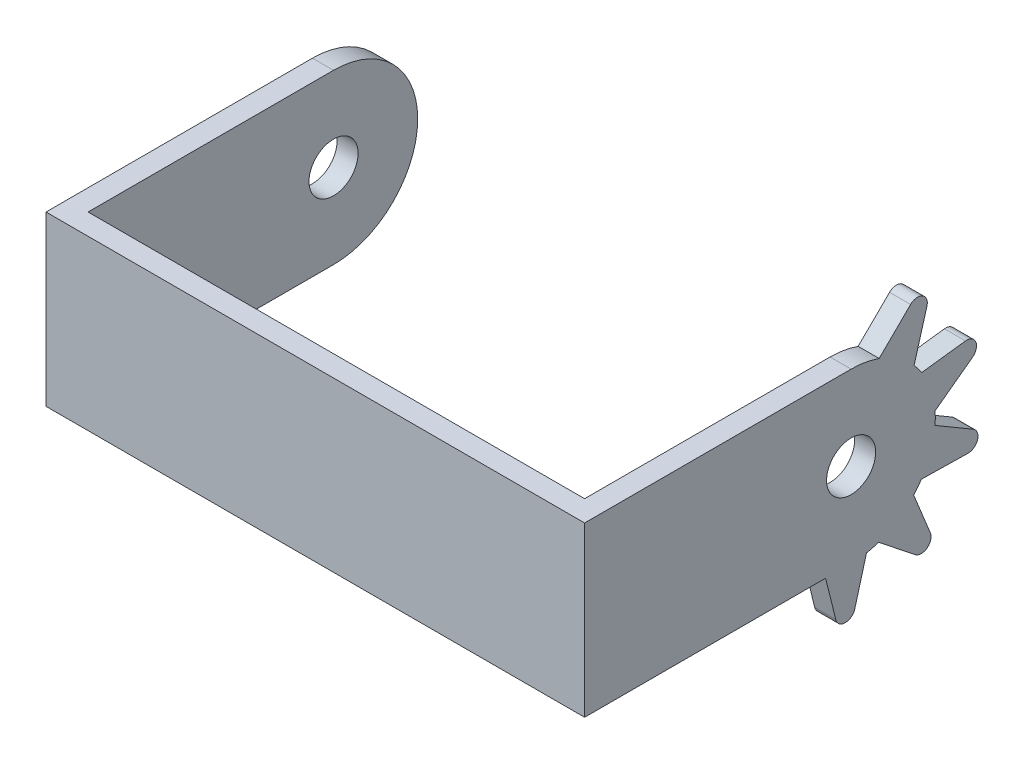
ISO-10303-21;
HEADER;
FILE_DESCRIPTION(('STEP AP214'),'2;1');
FILE_NAME('part.step','',(''),(''),'','','');
FILE_SCHEMA(('AUTOMOTIVE_DESIGN { 1 0 10303 214 1 1 1 1 }'));
ENDSEC;
DATA;
#1=APPLICATION_CONTEXT('core data for automotive mechanical design processes');
#2=APPLICATION_PROTOCOL_DEFINITION('international standard','automotive_design',2000,#1);
#3=PRODUCT_CONTEXT('',#1,'mechanical');
#4=PRODUCT('Part','Part','',(#3));
#5=PRODUCT_RELATED_PRODUCT_CATEGORY('part','',(#4));
#6=PRODUCT_DEFINITION_FORMATION('','',#4);
#7=PRODUCT_DEFINITION_CONTEXT('part definition',#1,'design');
#8=PRODUCT_DEFINITION('design','',#6,#7);
#9=PRODUCT_DEFINITION_SHAPE('','',#8);
#10=(LENGTH_UNIT() NAMED_UNIT(*) SI_UNIT(.MILLI.,.METRE.));
#11=(NAMED_UNIT(*) PLANE_ANGLE_UNIT() SI_UNIT($,.RADIAN.));
#12=(NAMED_UNIT(*) SI_UNIT($,.STERADIAN.) SOLID_ANGLE_UNIT());
#13=UNCERTAINTY_MEASURE_WITH_UNIT(LENGTH_MEASURE(1.E-05),#10,'distance_accuracy_value','');
#14=(GEOMETRIC_REPRESENTATION_CONTEXT(3) GLOBAL_UNCERTAINTY_ASSIGNED_CONTEXT((#13)) GLOBAL_UNIT_ASSIGNED_CONTEXT((#10,
#11,#12)) REPRESENTATION_CONTEXT('',''));
#15=CARTESIAN_POINT('',(0.,0.,0.));
#16=DIRECTION('',(0.,0.,1.));
#17=DIRECTION('',(1.,0.,0.));
#18=AXIS2_PLACEMENT_3D('',#15,#16,#17);
#19=CARTESIAN_POINT('',(38.4,6.,-19.));
#20=DIRECTION('',(-1.,0.,0.));
#21=DIRECTION('',(0.,0.,1.));
#22=AXIS2_PLACEMENT_3D('',#19,#20,#21);
#23=CYLINDRICAL_SURFACE('',#22,6.);
#24=DIRECTION('',(1.,0.,0.));
#25=VECTOR('',#24,1.);
#26=CARTESIAN_POINT('',(31.5101792591606,1.98768601255906,-23.4610913985465));
#27=LINE('',#26,#25);
#28=CARTESIAN_POINT('',(36.9,1.98768601255906,-23.4610913985465));
#29=VERTEX_POINT('',#28);
#30=CARTESIAN_POINT('',(38.4,1.98768601255906,-23.4610913985465));
#31=VERTEX_POINT('',#30);
#32=EDGE_CURVE('E269',#29,#31,#27,.T.);
#33=ORIENTED_EDGE('',*,*,#32,.F.);
#34=CARTESIAN_POINT('',(36.9,6.,-19.));
#35=DIRECTION('',(1.,0.,0.));
#36=DIRECTION('',(0.,0.,-1.));
#37=AXIS2_PLACEMENT_3D('',#34,#35,#36);
#38=CIRCLE('',#37,6.);
#39=CARTESIAN_POINT('',(36.9,2.69507903422514,-24.0077437444404));
#40=VERTEX_POINT('',#39);
#41=EDGE_CURVE('E435',#40,#29,#38,.F.);
#42=ORIENTED_EDGE('',*,*,#41,.F.);
#43=DIRECTION('',(1.,0.,0.));
#44=VECTOR('',#43,1.);
#45=CARTESIAN_POINT('',(31.5101792591606,2.69507903422514,-24.0077437444404));
#46=LINE('',#45,#44);
#47=CARTESIAN_POINT('',(38.4,2.69507903422514,-24.0077437444404));
#48=VERTEX_POINT('',#47);
#49=EDGE_CURVE('E58',#40,#48,#46,.T.);
#50=ORIENTED_EDGE('',*,*,#49,.T.);
#51=CARTESIAN_POINT('',(38.4,6.,-19.));
#52=DIRECTION('',(-1.,0.,0.));
#53=DIRECTION('',(0.,0.,1.));
#54=AXIS2_PLACEMENT_3D('',#51,#52,#53);
#55=CIRCLE('',#54,6.);
#56=EDGE_CURVE('E442',#31,#48,#55,.F.);
#57=ORIENTED_EDGE('',*,*,#56,.F.);
#58=EDGE_LOOP('',(#33,#42,#50,#57));
#59=FACE_BOUND('',#58,.T.);
#60=ADVANCED_FACE('F35',(#59),#23,.T.);
#61=DIRECTION('',(1.,0.,0.));
#62=VECTOR('',#61,1.);
#63=CARTESIAN_POINT('',(31.5101792591606,5.5325576704835,-24.9817637590076));
#64=LINE('',#63,#62);
#65=CARTESIAN_POINT('',(36.9,5.5325576704835,-24.9817637590076));
#66=VERTEX_POINT('',#65);
#67=CARTESIAN_POINT('',(38.4,5.5325576704835,-24.9817637590076));
#68=VERTEX_POINT('',#67);
#69=EDGE_CURVE('E291',#66,#68,#64,.T.);
#70=ORIENTED_EDGE('',*,*,#69,.F.);
#71=CARTESIAN_POINT('',(36.9,6.,-25.));
#72=VERTEX_POINT('',#71);
#73=EDGE_CURVE('E431',#72,#66,#38,.F.);
#74=ORIENTED_EDGE('',*,*,#73,.F.);
#75=DIRECTION('',(-1.,0.,0.));
#76=VECTOR('',#75,1.);
#77=CARTESIAN_POINT('',(38.4,6.,-25.));
#78=LINE('',#77,#76);
#79=CARTESIAN_POINT('',(38.4,6.,-25.));
#80=VERTEX_POINT('',#79);
#81=EDGE_CURVE('E371',#72,#80,#78,.F.);
#82=ORIENTED_EDGE('',*,*,#81,.T.);
#83=EDGE_CURVE('E439',#68,#80,#55,.F.);
#84=ORIENTED_EDGE('',*,*,#83,.F.);
#85=EDGE_LOOP('',(#70,#74,#82,#84));
#86=FACE_BOUND('',#85,.T.);
#87=ADVANCED_FACE('F450',(#86),#23,.T.);
#88=CARTESIAN_POINT('',(0.,6.,-19.0000000000001));
#89=DIRECTION('',(1.,0.,0.));
#90=DIRECTION('',(0.,0.,-1.));
#91=AXIS2_PLACEMENT_3D('',#88,#89,#90);
#92=CYLINDRICAL_SURFACE('',#91,6.);
#93=DIRECTION('',(1.,0.,0.));
#94=VECTOR('',#93,1.);
#95=CARTESIAN_POINT('',(31.5101792591606,9.27062012041001,-24.0302131195377));
#96=LINE('',#95,#94);
#97=CARTESIAN_POINT('',(36.9,9.27062012041001,-24.0302131195377));
#98=VERTEX_POINT('',#97);
#99=CARTESIAN_POINT('',(38.4,9.27062012041001,-24.0302131195377));
#100=VERTEX_POINT('',#99);
#101=EDGE_CURVE('E313',#98,#100,#96,.T.);
#102=ORIENTED_EDGE('',*,*,#101,.F.);
#103=CARTESIAN_POINT('',(36.9,6.,-19.));
#104=DIRECTION('',(1.,0.,0.));
#105=DIRECTION('',(0.,0.,-1.));
#106=AXIS2_PLACEMENT_3D('',#103,#104,#105);
#107=CIRCLE('',#106,6.);
#108=CARTESIAN_POINT('',(36.9,9.98173252569031,-23.4884079687413));
#109=VERTEX_POINT('',#108);
#110=EDGE_CURVE('E430',#109,#98,#107,.F.);
#111=ORIENTED_EDGE('',*,*,#110,.F.);
#112=DIRECTION('',(1.,0.,0.));
#113=VECTOR('',#112,1.);
#114=CARTESIAN_POINT('',(31.5101792591606,9.98173252569031,-23.4884079687412));
#115=LINE('',#114,#113);
#116=CARTESIAN_POINT('',(38.4,9.98173252569031,-23.4884079687412));
#117=VERTEX_POINT('',#116);
#118=EDGE_CURVE('E349',#109,#117,#115,.T.);
#119=ORIENTED_EDGE('',*,*,#118,.T.);
#120=CARTESIAN_POINT('',(38.4,6.,-19.));
#121=DIRECTION('',(-1.,0.,0.));
#122=DIRECTION('',(0.,0.,1.));
#123=AXIS2_PLACEMENT_3D('',#120,#121,#122);
#124=CIRCLE('',#123,6.);
#125=EDGE_CURVE('E440',#100,#117,#124,.F.);
#126=ORIENTED_EDGE('',*,*,#125,.F.);
#127=EDGE_LOOP('',(#102,#111,#119,#126));
#128=FACE_BOUND('',#127,.T.);
#129=ADVANCED_FACE('F499',(#128),#92,.T.);
#130=DIRECTION('',(1.,0.,0.));
#131=VECTOR('',#130,1.);
#132=CARTESIAN_POINT('',(31.5101792591606,11.656957124219,-20.9997090025172));
#133=LINE('',#132,#131);
#134=CARTESIAN_POINT('',(36.9,11.656957124219,-20.9997090025172));
#135=VERTEX_POINT('',#134);
#136=CARTESIAN_POINT('',(38.4,11.656957124219,-20.9997090025172));
#137=VERTEX_POINT('',#136);
#138=EDGE_CURVE('E338',#135,#137,#133,.T.);
#139=ORIENTED_EDGE('',*,*,#138,.F.);
#140=CARTESIAN_POINT('',(36.9,12.,-19.));
#141=VERTEX_POINT('',#140);
#142=EDGE_CURVE('E426',#141,#135,#107,.F.);
#143=ORIENTED_EDGE('',*,*,#142,.F.);
#144=DIRECTION('',(-1.,0.,0.));
#145=VECTOR('',#144,1.);
#146=CARTESIAN_POINT('',(36.9,12.,-19.));
#147=LINE('',#146,#145);
#148=CARTESIAN_POINT('',(38.4,12.,-19.));
#149=VERTEX_POINT('',#148);
#150=EDGE_CURVE('E421',#149,#141,#147,.T.);
#151=ORIENTED_EDGE('',*,*,#150,.F.);
#152=EDGE_CURVE('E434',#137,#149,#124,.F.);
#153=ORIENTED_EDGE('',*,*,#152,.F.);
#154=EDGE_LOOP('',(#139,#143,#151,#153));
#155=FACE_BOUND('',#154,.T.);
#156=ADVANCED_FACE('F512',(#155),#92,.T.);
#157=CARTESIAN_POINT('',(0.,12.,-25.));
#158=DIRECTION('',(1.,0.,0.));
#159=DIRECTION('',(0.,0.,-1.));
#160=AXIS2_PLACEMENT_3D('',#157,#158,#159);
#161=PLANE('',#160);
#162=CARTESIAN_POINT('',(0.,6.,-19.));
#163=DIRECTION('',(-1.,0.,0.));
#164=DIRECTION('',(0.,0.,1.));
#165=AXIS2_PLACEMENT_3D('',#162,#163,#164);
#166=CIRCLE('',#165,1.75);
#167=CARTESIAN_POINT('',(0.,6.,-17.25));
#168=VERTEX_POINT('',#167);
#169=EDGE_CURVE('E368',#168,#168,#166,.T.);
#170=ORIENTED_EDGE('',*,*,#169,.F.);
#171=EDGE_LOOP('',(#170));
#172=FACE_BOUND('',#171,.T.);
#173=CARTESIAN_POINT('',(0.,6.,-19.));
#174=DIRECTION('',(1.,0.,0.));
#175=DIRECTION('',(0.,0.,-1.));
#176=AXIS2_PLACEMENT_3D('',#173,#174,#175);
#177=CIRCLE('',#176,6.);
#178=CARTESIAN_POINT('',(0.,12.,-19.));
#179=VERTEX_POINT('',#178);
#180=CARTESIAN_POINT('',(0.,6.,-25.));
#181=VERTEX_POINT('',#180);
#182=EDGE_CURVE('E410',#179,#181,#177,.F.);
#183=ORIENTED_EDGE('',*,*,#182,.T.);
#184=CARTESIAN_POINT('',(0.,6.,-19.));
#185=DIRECTION('',(1.,0.,0.));
#186=DIRECTION('',(0.,0.,-1.));
#187=AXIS2_PLACEMENT_3D('',#184,#185,#186);
#188=CIRCLE('',#187,6.);
#189=CARTESIAN_POINT('',(0.,0.,-19.));
#190=VERTEX_POINT('',#189);
#191=EDGE_CURVE('E412',#181,#190,#188,.F.);
#192=ORIENTED_EDGE('',*,*,#191,.T.);
#193=DIRECTION('',(0.,0.,1.));
#194=VECTOR('',#193,1.);
#195=CARTESIAN_POINT('',(0.,0.,-25.));
#196=LINE('',#195,#194);
#197=CARTESIAN_POINT('',(0.,0.,0.));
#198=VERTEX_POINT('',#197);
#199=EDGE_CURVE('E388',#190,#198,#196,.T.);
#200=ORIENTED_EDGE('',*,*,#199,.T.);
#201=DIRECTION('',(0.,-1.,0.));
#202=VECTOR('',#201,1.);
#203=CARTESIAN_POINT('',(0.,12.,0.));
#204=LINE('',#203,#202);
#205=CARTESIAN_POINT('',(0.,12.,0.));
#206=VERTEX_POINT('',#205);
#207=EDGE_CURVE('E407',#206,#198,#204,.T.);
#208=ORIENTED_EDGE('',*,*,#207,.F.);
#209=DIRECTION('',(0.,0.,1.));
#210=VECTOR('',#209,1.);
#211=CARTESIAN_POINT('',(0.,12.,-25.));
#212=LINE('',#211,#210);
#213=EDGE_CURVE('E372',#179,#206,#212,.T.);
#214=ORIENTED_EDGE('',*,*,#213,.F.);
#215=EDGE_LOOP('',(#183,#192,#200,#208,#214));
#216=FACE_BOUND('',#215,.T.);
#217=ADVANCED_FACE('F523',(#172,#216),#161,.F.);
#218=CARTESIAN_POINT('',(0.,12.,0.));
#219=DIRECTION('',(0.,0.,-1.));
#220=DIRECTION('',(-1.,0.,0.));
#221=AXIS2_PLACEMENT_3D('',#218,#219,#220);
#222=PLANE('',#221);
#223=DIRECTION('',(1.,0.,0.));
#224=VECTOR('',#223,1.);
#225=CARTESIAN_POINT('',(0.,0.,0.));
#226=LINE('',#225,#224);
#227=CARTESIAN_POINT('',(38.4,0.,0.));
#228=VERTEX_POINT('',#227);
#229=EDGE_CURVE('E390',#198,#228,#226,.T.);
#230=ORIENTED_EDGE('',*,*,#229,.T.);
#231=DIRECTION('',(0.,-1.,0.));
#232=VECTOR('',#231,1.);
#233=CARTESIAN_POINT('',(38.4,12.,0.));
#234=LINE('',#233,#232);
#235=CARTESIAN_POINT('',(38.4,12.,0.));
#236=VERTEX_POINT('',#235);
#237=EDGE_CURVE('E405',#236,#228,#234,.T.);
#238=ORIENTED_EDGE('',*,*,#237,.F.);
#239=DIRECTION('',(1.,0.,0.));
#240=VECTOR('',#239,1.);
#241=CARTESIAN_POINT('',(0.,12.,0.));
#242=LINE('',#241,#240);
#243=EDGE_CURVE('E374',#206,#236,#242,.T.);
#244=ORIENTED_EDGE('',*,*,#243,.F.);
#245=ORIENTED_EDGE('',*,*,#207,.T.);
#246=EDGE_LOOP('',(#230,#238,#244,#245));
#247=FACE_BOUND('',#246,.T.);
#248=ADVANCED_FACE('F529',(#247),#222,.F.);
#249=CARTESIAN_POINT('',(38.4,12.,0.));
#250=DIRECTION('',(-1.,0.,0.));
#251=DIRECTION('',(0.,0.,1.));
#252=AXIS2_PLACEMENT_3D('',#249,#250,#251);
#253=PLANE('',#252);
#254=CARTESIAN_POINT('',(38.4,6.,-19.));
#255=DIRECTION('',(1.,0.,0.));
#256=DIRECTION('',(0.,0.,-1.));
#257=AXIS2_PLACEMENT_3D('',#254,#255,#256);
#258=CIRCLE('',#257,1.75);
#259=CARTESIAN_POINT('',(38.4,6.,-20.75));
#260=VERTEX_POINT('',#259);
#261=EDGE_CURVE('E359',#260,#260,#258,.T.);
#262=ORIENTED_EDGE('',*,*,#261,.F.);
#263=EDGE_LOOP('',(#262));
#264=FACE_BOUND('',#263,.T.);
#265=DIRECTION('',(0.,0.,-1.));
#266=VECTOR('',#265,1.);
#267=CARTESIAN_POINT('',(38.4,0.,0.));
#268=LINE('',#267,#266);
#269=CARTESIAN_POINT('',(38.4,0.,-17.1803883802412));
#270=VERTEX_POINT('',#269);
#271=EDGE_CURVE('E239',#228,#270,#268,.T.);
#272=ORIENTED_EDGE('',*,*,#271,.T.);
#273=DIRECTION('',(0.,-0.970350908801074,-0.24170046294728));
#274=VECTOR('',#273,1.);
#275=CARTESIAN_POINT('',(38.4,-2.92064558122937,-17.9078792113265));
#276=LINE('',#275,#274);
#277=CARTESIAN_POINT('',(38.4,-2.92064558122937,-17.9078792113265));
#278=VERTEX_POINT('',#277);
#279=EDGE_CURVE('E230',#270,#278,#276,.T.);
#280=ORIENTED_EDGE('',*,*,#279,.T.);
#281=CARTESIAN_POINT('',(38.4,-2.75145525716627,-18.5871248474872));
#282=DIRECTION('',(1.,0.,0.));
#283=DIRECTION('',(0.,0.,-1.));
#284=AXIS2_PLACEMENT_3D('',#281,#282,#283);
#285=CIRCLE('',#284,0.700000000000001);
#286=CARTESIAN_POINT('',(38.4,-2.93688346534044,-19.2621184619854));
#287=VERTEX_POINT('',#286);
#288=EDGE_CURVE('E235',#278,#287,#285,.T.);
#289=ORIENTED_EDGE('',*,*,#288,.T.);
#290=DIRECTION('',(0.,0.964276592140255,-0.264897440248817));
#291=VECTOR('',#290,1.);
#292=CARTESIAN_POINT('',(38.4,0.101076921048923,-20.0966797657558));
#293=LINE('',#292,#291);
#294=CARTESIAN_POINT('',(38.4,0.101076921048923,-20.0966797657558));
#295=VERTEX_POINT('',#294);
#296=EDGE_CURVE('E251',#287,#295,#293,.T.);
#297=ORIENTED_EDGE('',*,*,#296,.T.);
#298=CARTESIAN_POINT('',(38.4,0.329508674429189,-20.961001817089));
#299=VERTEX_POINT('',#298);
#300=EDGE_CURVE('E43',#295,#299,#55,.F.);
#301=ORIENTED_EDGE('',*,*,#300,.T.);
#302=DIRECTION('',(0.,-0.6226932155362,-0.782466075510746));
#303=VECTOR('',#302,1.);
#304=CARTESIAN_POINT('',(38.4,-1.74206498138611,-23.564107276013));
#305=LINE('',#304,#303);
#306=CARTESIAN_POINT('',(38.4,-1.74206498138611,-23.564107276013));
#307=VERTEX_POINT('',#306);
#308=EDGE_CURVE('E264',#299,#307,#305,.T.);
#309=ORIENTED_EDGE('',*,*,#308,.T.);
#310=CARTESIAN_POINT('',(38.4,-1.19433872852859,-23.9999925268884));
#311=DIRECTION('',(1.,0.,0.));
#312=DIRECTION('',(0.,0.,-1.));
#313=AXIS2_PLACEMENT_3D('',#310,#311,#312);
#314=CIRCLE('',#313,0.700000000000001);
#315=CARTESIAN_POINT('',(38.4,-0.930538739534189,-24.6483825066124));
#316=VERTEX_POINT('',#315);
#317=EDGE_CURVE('E274',#307,#316,#314,.T.);
#318=ORIENTED_EDGE('',*,*,#317,.T.);
#319=DIRECTION('',(0.,0.926271399605786,0.376857127134858));
#320=VECTOR('',#319,1.);
#321=CARTESIAN_POINT('',(38.4,1.98768601255906,-23.4610913985465));
#322=LINE('',#321,#320);
#323=EDGE_CURVE('E277',#316,#31,#322,.T.);
#324=ORIENTED_EDGE('',*,*,#323,.T.);
#325=ORIENTED_EDGE('',*,*,#56,.T.);
#326=DIRECTION('',(0.,-0.01768057624368,-0.999843686394874));
#327=VECTOR('',#326,1.);
#328=CARTESIAN_POINT('',(38.4,2.63625935375937,-27.3340202944191));
#329=LINE('',#328,#327);
#330=CARTESIAN_POINT('',(38.4,2.63625935375937,-27.3340202944191));
#331=VERTEX_POINT('',#330);
#332=EDGE_CURVE('E287',#48,#331,#329,.T.);
#333=ORIENTED_EDGE('',*,*,#332,.T.);
#334=CARTESIAN_POINT('',(38.4,3.33614993423578,-27.3463966977896));
#335=DIRECTION('',(1.,0.,0.));
#336=DIRECTION('',(0.,0.,-1.));
#337=AXIS2_PLACEMENT_3D('',#334,#335,#336);
#338=CIRCLE('',#337,0.699999999999999);
#339=CARTESIAN_POINT('',(38.4,3.94015134728499,-27.7002077957424));
#340=VERTEX_POINT('',#339);
#341=EDGE_CURVE('E296',#331,#340,#338,.T.);
#342=ORIENTED_EDGE('',*,*,#341,.T.);
#343=DIRECTION('',(0.,0.505444425646849,0.862859161498867));
#344=VECTOR('',#343,1.);
#345=CARTESIAN_POINT('',(38.4,5.5325576704835,-24.9817637590076));
#346=LINE('',#345,#344);
#347=EDGE_CURVE('E299',#340,#68,#346,.T.);
#348=ORIENTED_EDGE('',*,*,#347,.T.);
#349=ORIENTED_EDGE('',*,*,#83,.T.);
#350=CARTESIAN_POINT('',(38.4,6.42655115037831,-24.9848186368603));
#351=VERTEX_POINT('',#350);
#352=EDGE_CURVE('E436',#80,#351,#124,.F.);
#353=ORIENTED_EDGE('',*,*,#352,.T.);
#354=DIRECTION('',(0.,0.594639327093802,-0.803992581230343));
#355=VECTOR('',#354,1.);
#356=CARTESIAN_POINT('',(38.4,8.40479522624884,-27.6595384012527));
#357=LINE('',#356,#355);
#358=CARTESIAN_POINT('',(38.4,8.40479522624884,-27.6595384012527));
#359=VERTEX_POINT('',#358);
#360=EDGE_CURVE('E309',#351,#359,#357,.T.);
#361=ORIENTED_EDGE('',*,*,#360,.T.);
#362=CARTESIAN_POINT('',(38.4,8.96759003311008,-27.2432908722871));
#363=DIRECTION('',(1.,0.,0.));
#364=DIRECTION('',(0.,0.,-1.));
#365=AXIS2_PLACEMENT_3D('',#362,#363,#364);
#366=CIRCLE('',#365,0.700000000000001);
#367=CARTESIAN_POINT('',(38.4,9.66216312128219,-27.156295325349));
#368=VERTEX_POINT('',#367);
#369=EDGE_CURVE('E318',#359,#368,#366,.T.);
#370=ORIENTED_EDGE('',*,*,#369,.T.);
#371=DIRECTION('',(0.,-0.124279352768693,0.992247268817302));
#372=VECTOR('',#371,1.);
#373=CARTESIAN_POINT('',(38.4,9.27062012041001,-24.0302131195377));
#374=LINE('',#373,#372);
#375=EDGE_CURVE('E321',#368,#100,#374,.T.);
#376=ORIENTED_EDGE('',*,*,#375,.T.);
#377=ORIENTED_EDGE('',*,*,#125,.T.);
#378=DIRECTION('',(0.,0.961198769080563,-0.275856713382167));
#379=VECTOR('',#378,1.);
#380=CARTESIAN_POINT('',(38.4,13.1794452971628,-24.4061271376103));
#381=LINE('',#380,#379);
#382=CARTESIAN_POINT('',(38.4,13.1794452971628,-24.4061271376103));
#383=VERTEX_POINT('',#382);
#384=EDGE_CURVE('E334',#117,#383,#381,.T.);
#385=ORIENTED_EDGE('',*,*,#384,.T.);
#386=CARTESIAN_POINT('',(38.4,13.3725449965303,-23.7332879992539));
#387=DIRECTION('',(1.,0.,0.));
#388=DIRECTION('',(0.,0.,-1.));
#389=AXIS2_PLACEMENT_3D('',#386,#387,#388);
#390=CIRCLE('',#389,0.699999999999999);
#391=CARTESIAN_POINT('',(38.4,13.8706273426367,-23.2414404857935));
#392=VERTEX_POINT('',#391);
#393=EDGE_CURVE('E343',#383,#392,#390,.T.);
#394=ORIENTED_EDGE('',*,*,#393,.T.);
#395=DIRECTION('',(0.,-0.702639304943415,0.711546208723394));
#396=VECTOR('',#395,1.);
#397=CARTESIAN_POINT('',(38.4,11.656957124219,-20.9997090025172));
#398=LINE('',#397,#396);
#399=EDGE_CURVE('E346',#392,#137,#398,.T.);
#400=ORIENTED_EDGE('',*,*,#399,.T.);
#401=ORIENTED_EDGE('',*,*,#152,.T.);
#402=DIRECTION('',(0.,0.,-1.));
#403=VECTOR('',#402,1.);
#404=CARTESIAN_POINT('',(38.4,12.,0.));
#405=LINE('',#404,#403);
#406=EDGE_CURVE('E377',#236,#149,#405,.T.);
#407=ORIENTED_EDGE('',*,*,#406,.F.);
#408=ORIENTED_EDGE('',*,*,#237,.T.);
#409=EDGE_LOOP('',(#272,#280,#289,#297,#301,#309,#318,#324,#325,#333,#342,#348,#349,#353,#361,
#370,#376,#377,#385,#394,#400,#401,#407,#408));
#410=FACE_BOUND('',#409,.T.);
#411=ADVANCED_FACE('F232',(#264,#410),#253,.F.);
#412=CARTESIAN_POINT('',(36.9,12.,-25.));
#413=DIRECTION('',(1.,0.,0.));
#414=DIRECTION('',(0.,0.,-1.));
#415=AXIS2_PLACEMENT_3D('',#412,#413,#414);
#416=PLANE('',#415);
#417=DIRECTION('',(0.,0.970350908801074,0.24170046294728));
#418=VECTOR('',#417,1.);
#419=CARTESIAN_POINT('',(36.9,-2.92064558122937,-17.9078792113265));
#420=LINE('',#419,#418);
#421=CARTESIAN_POINT('',(36.9,-2.92064558122937,-17.9078792113265));
#422=VERTEX_POINT('',#421);
#423=CARTESIAN_POINT('',(36.9,0.,-17.1803883802412));
#424=VERTEX_POINT('',#423);
#425=EDGE_CURVE('E247',#422,#424,#420,.T.);
#426=ORIENTED_EDGE('',*,*,#425,.T.);
#427=DIRECTION('',(0.,0.,1.));
#428=VECTOR('',#427,1.);
#429=CARTESIAN_POINT('',(36.9,0.,-25.));
#430=LINE('',#429,#428);
#431=CARTESIAN_POINT('',(36.9,0.,-1.5));
#432=VERTEX_POINT('',#431);
#433=EDGE_CURVE('E394',#424,#432,#430,.T.);
#434=ORIENTED_EDGE('',*,*,#433,.T.);
#435=DIRECTION('',(0.,-1.,0.));
#436=VECTOR('',#435,1.);
#437=CARTESIAN_POINT('',(36.9,12.,-1.5));
#438=LINE('',#437,#436);
#439=CARTESIAN_POINT('',(36.9,12.,-1.5));
#440=VERTEX_POINT('',#439);
#441=EDGE_CURVE('E402',#440,#432,#438,.T.);
#442=ORIENTED_EDGE('',*,*,#441,.F.);
#443=DIRECTION('',(0.,0.,1.));
#444=VECTOR('',#443,1.);
#445=CARTESIAN_POINT('',(36.9,12.,-25.));
#446=LINE('',#445,#444);
#447=EDGE_CURVE('E380',#141,#440,#446,.T.);
#448=ORIENTED_EDGE('',*,*,#447,.F.);
#449=ORIENTED_EDGE('',*,*,#142,.T.);
#450=DIRECTION('',(0.,0.702639304943415,-0.711546208723394));
#451=VECTOR('',#450,1.);
#452=CARTESIAN_POINT('',(36.9,11.656957124219,-20.9997090025172));
#453=LINE('',#452,#451);
#454=CARTESIAN_POINT('',(36.9,13.8706273426367,-23.2414404857935));
#455=VERTEX_POINT('',#454);
#456=EDGE_CURVE('E337',#135,#455,#453,.T.);
#457=ORIENTED_EDGE('',*,*,#456,.T.);
#458=CARTESIAN_POINT('',(36.9,13.3725449965303,-23.7332879992539));
#459=DIRECTION('',(1.,0.,0.));
#460=DIRECTION('',(0.,0.,-1.));
#461=AXIS2_PLACEMENT_3D('',#458,#459,#460);
#462=CIRCLE('',#461,0.699999999999999);
#463=CARTESIAN_POINT('',(36.9,13.1794452971628,-24.4061271376103));
#464=VERTEX_POINT('',#463);
#465=EDGE_CURVE('E335',#455,#464,#462,.F.);
#466=ORIENTED_EDGE('',*,*,#465,.T.);
#467=DIRECTION('',(0.,-0.961198769080563,0.275856713382167));
#468=VECTOR('',#467,1.);
#469=CARTESIAN_POINT('',(36.9,13.1794452971628,-24.4061271376103));
#470=LINE('',#469,#468);
#471=EDGE_CURVE('E340',#464,#109,#470,.T.);
#472=ORIENTED_EDGE('',*,*,#471,.T.);
#473=ORIENTED_EDGE('',*,*,#110,.T.);
#474=DIRECTION('',(0.,0.124279352768693,-0.992247268817302));
#475=VECTOR('',#474,1.);
#476=CARTESIAN_POINT('',(36.9,9.27062012041001,-24.0302131195377));
#477=LINE('',#476,#475);
#478=CARTESIAN_POINT('',(36.9,9.66216312128219,-27.156295325349));
#479=VERTEX_POINT('',#478);
#480=EDGE_CURVE('E312',#98,#479,#477,.T.);
#481=ORIENTED_EDGE('',*,*,#480,.T.);
#482=CARTESIAN_POINT('',(36.9,8.96759003311008,-27.2432908722871));
#483=DIRECTION('',(1.,0.,0.));
#484=DIRECTION('',(0.,0.,-1.));
#485=AXIS2_PLACEMENT_3D('',#482,#483,#484);
#486=CIRCLE('',#485,0.700000000000001);
#487=CARTESIAN_POINT('',(36.9,8.40479522624884,-27.6595384012527));
#488=VERTEX_POINT('',#487);
#489=EDGE_CURVE('E310',#479,#488,#486,.F.);
#490=ORIENTED_EDGE('',*,*,#489,.T.);
#491=DIRECTION('',(0.,-0.594639327093802,0.803992581230343));
#492=VECTOR('',#491,1.);
#493=CARTESIAN_POINT('',(36.9,8.40479522624884,-27.6595384012527));
#494=LINE('',#493,#492);
#495=CARTESIAN_POINT('',(36.9,6.42655115037831,-24.9848186368604));
#496=VERTEX_POINT('',#495);
#497=EDGE_CURVE('E315',#488,#496,#494,.T.);
#498=ORIENTED_EDGE('',*,*,#497,.T.);
#499=EDGE_CURVE('E425',#496,#72,#107,.F.);
#500=ORIENTED_EDGE('',*,*,#499,.T.);
#501=ORIENTED_EDGE('',*,*,#73,.T.);
#502=DIRECTION('',(0.,-0.505444425646849,-0.862859161498867));
#503=VECTOR('',#502,1.);
#504=CARTESIAN_POINT('',(36.9,5.5325576704835,-24.9817637590076));
#505=LINE('',#504,#503);
#506=CARTESIAN_POINT('',(36.9,3.94015134728499,-27.7002077957424));
#507=VERTEX_POINT('',#506);
#508=EDGE_CURVE('E290',#66,#507,#505,.T.);
#509=ORIENTED_EDGE('',*,*,#508,.T.);
#510=CARTESIAN_POINT('',(36.9,3.33614993423578,-27.3463966977896));
#511=DIRECTION('',(1.,0.,0.));
#512=DIRECTION('',(0.,0.,-1.));
#513=AXIS2_PLACEMENT_3D('',#510,#511,#512);
#514=CIRCLE('',#513,0.699999999999999);
#515=CARTESIAN_POINT('',(36.9,2.63625935375937,-27.3340202944191));
#516=VERTEX_POINT('',#515);
#517=EDGE_CURVE('E288',#507,#516,#514,.F.);
#518=ORIENTED_EDGE('',*,*,#517,.T.);
#519=DIRECTION('',(0.,0.01768057624368,0.999843686394874));
#520=VECTOR('',#519,1.);
#521=CARTESIAN_POINT('',(36.9,2.63625935375937,-27.3340202944191));
#522=LINE('',#521,#520);
#523=EDGE_CURVE('E293',#516,#40,#522,.T.);
#524=ORIENTED_EDGE('',*,*,#523,.T.);
#525=ORIENTED_EDGE('',*,*,#41,.T.);
#526=DIRECTION('',(0.,-0.926271399605786,-0.376857127134858));
#527=VECTOR('',#526,1.);
#528=CARTESIAN_POINT('',(36.9,1.98768601255906,-23.4610913985465));
#529=LINE('',#528,#527);
#530=CARTESIAN_POINT('',(36.9,-0.930538739534189,-24.6483825066124));
#531=VERTEX_POINT('',#530);
#532=EDGE_CURVE('E268',#29,#531,#529,.T.);
#533=ORIENTED_EDGE('',*,*,#532,.T.);
#534=CARTESIAN_POINT('',(36.9,-1.19433872852859,-23.9999925268884));
#535=DIRECTION('',(1.,0.,0.));
#536=DIRECTION('',(0.,0.,-1.));
#537=AXIS2_PLACEMENT_3D('',#534,#535,#536);
#538=CIRCLE('',#537,0.700000000000001);
#539=CARTESIAN_POINT('',(36.9,-1.74206498138611,-23.564107276013));
#540=VERTEX_POINT('',#539);
#541=EDGE_CURVE('E266',#531,#540,#538,.F.);
#542=ORIENTED_EDGE('',*,*,#541,.T.);
#543=DIRECTION('',(0.,0.6226932155362,0.782466075510746));
#544=VECTOR('',#543,1.);
#545=CARTESIAN_POINT('',(36.9,-1.74206498138611,-23.564107276013));
#546=LINE('',#545,#544);
#547=CARTESIAN_POINT('',(36.9,0.329508674429193,-20.961001817089));
#548=VERTEX_POINT('',#547);
#549=EDGE_CURVE('E271',#540,#548,#546,.T.);
#550=ORIENTED_EDGE('',*,*,#549,.T.);
#551=CARTESIAN_POINT('',(36.9,0.101076921048923,-20.0966797657558));
#552=VERTEX_POINT('',#551);
#553=EDGE_CURVE('E429',#548,#552,#38,.F.);
#554=ORIENTED_EDGE('',*,*,#553,.T.);
#555=DIRECTION('',(0.,-0.964276592140255,0.264897440248817));
#556=VECTOR('',#555,1.);
#557=CARTESIAN_POINT('',(36.9,0.101076921048923,-20.0966797657558));
#558=LINE('',#557,#556);
#559=CARTESIAN_POINT('',(36.9,-2.93688346534044,-19.2621184619854));
#560=VERTEX_POINT('',#559);
#561=EDGE_CURVE('E265',#552,#560,#558,.T.);
#562=ORIENTED_EDGE('',*,*,#561,.T.);
#563=CARTESIAN_POINT('',(36.9,-2.75145525716627,-18.5871248474872));
#564=DIRECTION('',(1.,0.,0.));
#565=DIRECTION('',(0.,0.,-1.));
#566=AXIS2_PLACEMENT_3D('',#563,#564,#565);
#567=CIRCLE('',#566,0.700000000000001);
#568=EDGE_CURVE('E261',#560,#422,#567,.F.);
#569=ORIENTED_EDGE('',*,*,#568,.T.);
#570=EDGE_LOOP('',(#426,#434,#442,#448,#449,#457,#466,#472,#473,#481,#490,#498,#500,#501,#509,
#518,#524,#525,#533,#542,#550,#554,#562,#569));
#571=FACE_BOUND('',#570,.T.);
#572=CARTESIAN_POINT('',(36.9,6.,-19.));
#573=DIRECTION('',(1.,0.,0.));
#574=DIRECTION('',(0.,0.,-1.));
#575=AXIS2_PLACEMENT_3D('',#572,#573,#574);
#576=CIRCLE('',#575,1.75);
#577=CARTESIAN_POINT('',(36.9,6.,-20.75));
#578=VERTEX_POINT('',#577);
#579=EDGE_CURVE('E362',#578,#578,#576,.F.);
#580=ORIENTED_EDGE('',*,*,#579,.F.);
#581=EDGE_LOOP('',(#580));
#582=FACE_BOUND('',#581,.T.);
#583=ADVANCED_FACE('F467',(#571,#582),#416,.F.);
#584=CARTESIAN_POINT('',(36.9,12.,-1.5));
#585=DIRECTION('',(0.,0.,1.));
#586=DIRECTION('',(1.,0.,0.));
#587=AXIS2_PLACEMENT_3D('',#584,#585,#586);
#588=PLANE('',#587);
#589=DIRECTION('',(-1.,0.,0.));
#590=VECTOR('',#589,1.);
#591=CARTESIAN_POINT('',(36.9,0.,-1.5));
#592=LINE('',#591,#590);
#593=CARTESIAN_POINT('',(1.5,0.,-1.5));
#594=VERTEX_POINT('',#593);
#595=EDGE_CURVE('E396',#432,#594,#592,.T.);
#596=ORIENTED_EDGE('',*,*,#595,.T.);
#597=DIRECTION('',(0.,-1.,0.));
#598=VECTOR('',#597,1.);
#599=CARTESIAN_POINT('',(1.5,12.,-1.5));
#600=LINE('',#599,#598);
#601=CARTESIAN_POINT('',(1.5,12.,-1.5));
#602=VERTEX_POINT('',#601);
#603=EDGE_CURVE('E387',#602,#594,#600,.T.);
#604=ORIENTED_EDGE('',*,*,#603,.F.);
#605=DIRECTION('',(-1.,0.,0.));
#606=VECTOR('',#605,1.);
#607=CARTESIAN_POINT('',(36.9,12.,-1.5));
#608=LINE('',#607,#606);
#609=EDGE_CURVE('E382',#440,#602,#608,.T.);
#610=ORIENTED_EDGE('',*,*,#609,.F.);
#611=ORIENTED_EDGE('',*,*,#441,.T.);
#612=EDGE_LOOP('',(#596,#604,#610,#611));
#613=FACE_BOUND('',#612,.T.);
#614=ADVANCED_FACE('F601',(#613),#588,.F.);
#615=CARTESIAN_POINT('',(1.5,12.,-1.5));
#616=DIRECTION('',(-1.,0.,0.));
#617=DIRECTION('',(0.,0.,1.));
#618=AXIS2_PLACEMENT_3D('',#615,#616,#617);
#619=PLANE('',#618);
#620=CARTESIAN_POINT('',(1.5,6.,-19.));
#621=DIRECTION('',(-1.,0.,0.));
#622=DIRECTION('',(0.,0.,1.));
#623=AXIS2_PLACEMENT_3D('',#620,#621,#622);
#624=CIRCLE('',#623,1.75);
#625=CARTESIAN_POINT('',(1.5,6.,-17.25));
#626=VERTEX_POINT('',#625);
#627=EDGE_CURVE('E365',#626,#626,#624,.F.);
#628=ORIENTED_EDGE('',*,*,#627,.F.);
#629=EDGE_LOOP('',(#628));
#630=FACE_BOUND('',#629,.T.);
#631=DIRECTION('',(0.,0.,-1.));
#632=VECTOR('',#631,1.);
#633=CARTESIAN_POINT('',(1.5,0.,-1.5));
#634=LINE('',#633,#632);
#635=CARTESIAN_POINT('',(1.5,0.,-19.));
#636=VERTEX_POINT('',#635);
#637=EDGE_CURVE('E375',#594,#636,#634,.T.);
#638=ORIENTED_EDGE('',*,*,#637,.T.);
#639=CARTESIAN_POINT('',(1.5,6.,-19.));
#640=DIRECTION('',(-1.,0.,0.));
#641=DIRECTION('',(0.,0.,1.));
#642=AXIS2_PLACEMENT_3D('',#639,#640,#641);
#643=CIRCLE('',#642,6.);
#644=CARTESIAN_POINT('',(1.5,6.,-25.));
#645=VERTEX_POINT('',#644);
#646=EDGE_CURVE('E419',#636,#645,#643,.F.);
#647=ORIENTED_EDGE('',*,*,#646,.T.);
#648=CARTESIAN_POINT('',(1.5,6.,-19.));
#649=DIRECTION('',(-1.,0.,0.));
#650=DIRECTION('',(0.,0.,1.));
#651=AXIS2_PLACEMENT_3D('',#648,#649,#650);
#652=CIRCLE('',#651,6.);
#653=CARTESIAN_POINT('',(1.5,12.,-19.));
#654=VERTEX_POINT('',#653);
#655=EDGE_CURVE('E417',#645,#654,#652,.F.);
#656=ORIENTED_EDGE('',*,*,#655,.T.);
#657=DIRECTION('',(0.,0.,-1.));
#658=VECTOR('',#657,1.);
#659=CARTESIAN_POINT('',(1.5,12.,-1.5));
#660=LINE('',#659,#658);
#661=EDGE_CURVE('E384',#602,#654,#660,.T.);
#662=ORIENTED_EDGE('',*,*,#661,.F.);
#663=ORIENTED_EDGE('',*,*,#603,.T.);
#664=EDGE_LOOP('',(#638,#647,#656,#662,#663));
#665=FACE_BOUND('',#664,.T.);
#666=ADVANCED_FACE('F596',(#630,#665),#619,.F.);
#667=CARTESIAN_POINT('',(0.,12.,0.));
#668=DIRECTION('',(0.,1.,0.));
#669=DIRECTION('',(0.,0.,1.));
#670=AXIS2_PLACEMENT_3D('',#667,#668,#669);
#671=PLANE('',#670);
#672=ORIENTED_EDGE('',*,*,#661,.T.);
#673=DIRECTION('',(-1.,0.,0.));
#674=VECTOR('',#673,1.);
#675=CARTESIAN_POINT('',(0.,12.,-19.));
#676=LINE('',#675,#674);
#677=EDGE_CURVE('E423',#654,#179,#676,.T.);
#678=ORIENTED_EDGE('',*,*,#677,.T.);
#679=ORIENTED_EDGE('',*,*,#213,.T.);
#680=ORIENTED_EDGE('',*,*,#243,.T.);
#681=ORIENTED_EDGE('',*,*,#406,.T.);
#682=ORIENTED_EDGE('',*,*,#150,.T.);
#683=ORIENTED_EDGE('',*,*,#447,.T.);
#684=ORIENTED_EDGE('',*,*,#609,.T.);
#685=EDGE_LOOP('',(#672,#678,#679,#680,#681,#682,#683,#684));
#686=FACE_BOUND('',#685,.T.);
#687=ADVANCED_FACE('F543',(#686),#671,.T.);
#688=CARTESIAN_POINT('',(0.,0.,0.));
#689=DIRECTION('',(0.,1.,0.));
#690=DIRECTION('',(0.,0.,1.));
#691=AXIS2_PLACEMENT_3D('',#688,#689,#690);
#692=PLANE('',#691);
#693=ORIENTED_EDGE('',*,*,#433,.F.);
#694=DIRECTION('',(1.,0.,0.));
#695=VECTOR('',#694,1.);
#696=CARTESIAN_POINT('',(0.,0.,-17.1803883802412));
#697=LINE('',#696,#695);
#698=EDGE_CURVE('E11',#424,#270,#697,.T.);
#699=ORIENTED_EDGE('',*,*,#698,.T.);
#700=ORIENTED_EDGE('',*,*,#271,.F.);
#701=ORIENTED_EDGE('',*,*,#229,.F.);
#702=ORIENTED_EDGE('',*,*,#199,.F.);
#703=DIRECTION('',(-1.,0.,0.));
#704=VECTOR('',#703,1.);
#705=CARTESIAN_POINT('',(0.,0.,-19.));
#706=LINE('',#705,#704);
#707=EDGE_CURVE('E414',#190,#636,#706,.F.);
#708=ORIENTED_EDGE('',*,*,#707,.T.);
#709=ORIENTED_EDGE('',*,*,#637,.F.);
#710=ORIENTED_EDGE('',*,*,#595,.F.);
#711=EDGE_LOOP('',(#693,#699,#700,#701,#702,#708,#709,#710));
#712=FACE_BOUND('',#711,.T.);
#713=ADVANCED_FACE('F595',(#712),#692,.F.);
#714=CARTESIAN_POINT('',(0.,6.,-19.));
#715=DIRECTION('',(1.,0.,0.));
#716=DIRECTION('',(0.,0.,-1.));
#717=AXIS2_PLACEMENT_3D('',#714,#715,#716);
#718=CYLINDRICAL_SURFACE('',#717,6.);
#719=ORIENTED_EDGE('',*,*,#677,.F.);
#720=ORIENTED_EDGE('',*,*,#655,.F.);
#721=DIRECTION('',(-1.,0.,0.));
#722=VECTOR('',#721,1.);
#723=CARTESIAN_POINT('',(1.5,6.,-25.));
#724=LINE('',#723,#722);
#725=EDGE_CURVE('E391',#181,#645,#724,.F.);
#726=ORIENTED_EDGE('',*,*,#725,.F.);
#727=ORIENTED_EDGE('',*,*,#182,.F.);
#728=EDGE_LOOP('',(#719,#720,#726,#727));
#729=FACE_BOUND('',#728,.T.);
#730=ADVANCED_FACE('F517',(#729),#718,.T.);
#731=CARTESIAN_POINT('',(1.5,6.,-19.));
#732=DIRECTION('',(-1.,0.,0.));
#733=DIRECTION('',(0.,0.,1.));
#734=AXIS2_PLACEMENT_3D('',#731,#732,#733);
#735=CYLINDRICAL_SURFACE('',#734,6.);
#736=ORIENTED_EDGE('',*,*,#646,.F.);
#737=ORIENTED_EDGE('',*,*,#707,.F.);
#738=ORIENTED_EDGE('',*,*,#191,.F.);
#739=ORIENTED_EDGE('',*,*,#725,.T.);
#740=EDGE_LOOP('',(#736,#737,#738,#739));
#741=FACE_BOUND('',#740,.T.);
#742=ADVANCED_FACE('F511',(#741),#735,.T.);
#743=DIRECTION('',(1.,0.,0.));
#744=VECTOR('',#743,1.);
#745=CARTESIAN_POINT('',(31.5101792591606,6.42655115037831,-24.9848186368603));
#746=LINE('',#745,#744);
#747=EDGE_CURVE('E324',#496,#351,#746,.T.);
#748=ORIENTED_EDGE('',*,*,#747,.T.);
#749=ORIENTED_EDGE('',*,*,#352,.F.);
#750=ORIENTED_EDGE('',*,*,#81,.F.);
#751=ORIENTED_EDGE('',*,*,#499,.F.);
#752=EDGE_LOOP('',(#748,#749,#750,#751));
#753=FACE_BOUND('',#752,.T.);
#754=ADVANCED_FACE('F37',(#753),#92,.T.);
#755=DIRECTION('',(1.,0.,0.));
#756=VECTOR('',#755,1.);
#757=CARTESIAN_POINT('',(31.5101792591606,0.101076921048923,-20.0966797657558));
#758=LINE('',#757,#756);
#759=EDGE_CURVE('E259',#552,#295,#758,.T.);
#760=ORIENTED_EDGE('',*,*,#759,.F.);
#761=ORIENTED_EDGE('',*,*,#553,.F.);
#762=DIRECTION('',(1.,0.,0.));
#763=VECTOR('',#762,1.);
#764=CARTESIAN_POINT('',(31.5101792591606,0.329508674429189,-20.961001817089));
#765=LINE('',#764,#763);
#766=EDGE_CURVE('E50',#548,#299,#765,.T.);
#767=ORIENTED_EDGE('',*,*,#766,.T.);
#768=ORIENTED_EDGE('',*,*,#300,.F.);
#769=EDGE_LOOP('',(#760,#761,#767,#768));
#770=FACE_BOUND('',#769,.T.);
#771=ADVANCED_FACE('F471',(#770),#23,.T.);
#772=CARTESIAN_POINT('',(38.401,6.,-19.));
#773=DIRECTION('',(-1.,0.,0.));
#774=DIRECTION('',(0.,0.,1.));
#775=AXIS2_PLACEMENT_3D('',#772,#773,#774);
#776=CYLINDRICAL_SURFACE('',#775,1.75);
#777=ORIENTED_EDGE('',*,*,#169,.T.);
#778=EDGE_LOOP('',(#777));
#779=FACE_BOUND('',#778,.T.);
#780=ORIENTED_EDGE('',*,*,#627,.T.);
#781=EDGE_LOOP('',(#780));
#782=FACE_BOUND('',#781,.T.);
#783=ADVANCED_FACE('F502',(#779,#782),#776,.F.);
#784=CARTESIAN_POINT('',(31.9502525316942,6.,-19.));
#785=DIRECTION('',(1.,0.,0.));
#786=DIRECTION('',(0.,0.,-1.));
#787=AXIS2_PLACEMENT_3D('',#784,#785,#786);
#788=CYLINDRICAL_SURFACE('',#787,1.75);
#789=ORIENTED_EDGE('',*,*,#579,.T.);
#790=EDGE_LOOP('',(#789));
#791=FACE_BOUND('',#790,.T.);
#792=ORIENTED_EDGE('',*,*,#261,.T.);
#793=EDGE_LOOP('',(#792));
#794=FACE_BOUND('',#793,.T.);
#795=ADVANCED_FACE('F508',(#791,#794),#788,.F.);
#796=CARTESIAN_POINT('',(31.5101792591606,11.656957124219,-20.9997090025172));
#797=DIRECTION('',(0.,0.711546208723394,0.702639304943414));
#798=DIRECTION('',(0.,-0.702639304943415,0.711546208723394));
#799=AXIS2_PLACEMENT_3D('',#796,#797,#798);
#800=PLANE('',#799);
#801=ORIENTED_EDGE('',*,*,#456,.F.);
#802=ORIENTED_EDGE('',*,*,#138,.T.);
#803=ORIENTED_EDGE('',*,*,#399,.F.);
#804=DIRECTION('',(1.,0.,0.));
#805=VECTOR('',#804,1.);
#806=CARTESIAN_POINT('',(31.5101792591606,13.8706273426367,-23.2414404857935));
#807=LINE('',#806,#805);
#808=EDGE_CURVE('E351',#455,#392,#807,.T.);
#809=ORIENTED_EDGE('',*,*,#808,.F.);
#810=EDGE_LOOP('',(#801,#802,#803,#809));
#811=FACE_BOUND('',#810,.T.);
#812=ADVANCED_FACE('F584',(#811),#800,.T.);
#813=CARTESIAN_POINT('',(31.5101792591606,13.3725449965303,-23.7332879992539));
#814=DIRECTION('',(1.,0.,0.));
#815=DIRECTION('',(0.,0.,-1.));
#816=AXIS2_PLACEMENT_3D('',#813,#814,#815);
#817=CYLINDRICAL_SURFACE('',#816,0.699999999999999);
#818=ORIENTED_EDGE('',*,*,#465,.F.);
#819=ORIENTED_EDGE('',*,*,#808,.T.);
#820=ORIENTED_EDGE('',*,*,#393,.F.);
#821=DIRECTION('',(1.,0.,0.));
#822=VECTOR('',#821,1.);
#823=CARTESIAN_POINT('',(31.5101792591606,13.1794452971628,-24.4061271376103));
#824=LINE('',#823,#822);
#825=EDGE_CURVE('E353',#464,#383,#824,.T.);
#826=ORIENTED_EDGE('',*,*,#825,.F.);
#827=EDGE_LOOP('',(#818,#819,#820,#826));
#828=FACE_BOUND('',#827,.T.);
#829=ADVANCED_FACE('F577',(#828),#817,.T.);
#830=CARTESIAN_POINT('',(31.5101792591606,13.1794452971628,-24.4061271376103));
#831=DIRECTION('',(0.,-0.275856713382167,-0.961198769080563));
#832=DIRECTION('',(0.,0.961198769080563,-0.275856713382167));
#833=AXIS2_PLACEMENT_3D('',#830,#831,#832);
#834=PLANE('',#833);
#835=ORIENTED_EDGE('',*,*,#471,.F.);
#836=ORIENTED_EDGE('',*,*,#825,.T.);
#837=ORIENTED_EDGE('',*,*,#384,.F.);
#838=ORIENTED_EDGE('',*,*,#118,.F.);
#839=EDGE_LOOP('',(#835,#836,#837,#838));
#840=FACE_BOUND('',#839,.T.);
#841=ADVANCED_FACE('F554',(#840),#834,.T.);
#842=CARTESIAN_POINT('',(31.5101792591606,9.27062012041001,-24.0302131195377));
#843=DIRECTION('',(0.,0.992247268817302,0.124279352768693));
#844=DIRECTION('',(0.,-0.124279352768693,0.992247268817302));
#845=AXIS2_PLACEMENT_3D('',#842,#843,#844);
#846=PLANE('',#845);
#847=ORIENTED_EDGE('',*,*,#480,.F.);
#848=ORIENTED_EDGE('',*,*,#101,.T.);
#849=ORIENTED_EDGE('',*,*,#375,.F.);
#850=DIRECTION('',(1.,0.,0.));
#851=VECTOR('',#850,1.);
#852=CARTESIAN_POINT('',(31.5101792591606,9.66216312128219,-27.156295325349));
#853=LINE('',#852,#851);
#854=EDGE_CURVE('E326',#479,#368,#853,.T.);
#855=ORIENTED_EDGE('',*,*,#854,.F.);
#856=EDGE_LOOP('',(#847,#848,#849,#855));
#857=FACE_BOUND('',#856,.T.);
#858=ADVANCED_FACE('F569',(#857),#846,.T.);
#859=CARTESIAN_POINT('',(31.5101792591606,8.96759003311008,-27.2432908722871));
#860=DIRECTION('',(1.,0.,0.));
#861=DIRECTION('',(0.,0.,-1.));
#862=AXIS2_PLACEMENT_3D('',#859,#860,#861);
#863=CYLINDRICAL_SURFACE('',#862,0.700000000000001);
#864=ORIENTED_EDGE('',*,*,#489,.F.);
#865=ORIENTED_EDGE('',*,*,#854,.T.);
#866=ORIENTED_EDGE('',*,*,#369,.F.);
#867=DIRECTION('',(1.,0.,0.));
#868=VECTOR('',#867,1.);
#869=CARTESIAN_POINT('',(31.5101792591606,8.40479522624884,-27.6595384012527));
#870=LINE('',#869,#868);
#871=EDGE_CURVE('E328',#488,#359,#870,.T.);
#872=ORIENTED_EDGE('',*,*,#871,.F.);
#873=EDGE_LOOP('',(#864,#865,#866,#872));
#874=FACE_BOUND('',#873,.T.);
#875=ADVANCED_FACE('F566',(#874),#863,.T.);
#876=CARTESIAN_POINT('',(31.5101792591606,8.40479522624884,-27.6595384012527));
#877=DIRECTION('',(0.,-0.803992581230343,-0.594639327093802));
#878=DIRECTION('',(0.,0.594639327093802,-0.803992581230343));
#879=AXIS2_PLACEMENT_3D('',#876,#877,#878);
#880=PLANE('',#879);
#881=ORIENTED_EDGE('',*,*,#497,.F.);
#882=ORIENTED_EDGE('',*,*,#871,.T.);
#883=ORIENTED_EDGE('',*,*,#360,.F.);
#884=ORIENTED_EDGE('',*,*,#747,.F.);
#885=EDGE_LOOP('',(#881,#882,#883,#884));
#886=FACE_BOUND('',#885,.T.);
#887=ADVANCED_FACE('F563',(#886),#880,.T.);
#888=CARTESIAN_POINT('',(31.5101792591606,5.5325576704835,-24.9817637590076));
#889=DIRECTION('',(0.,0.862859161498867,-0.505444425646849));
#890=DIRECTION('',(0.,0.505444425646849,0.862859161498867));
#891=AXIS2_PLACEMENT_3D('',#888,#889,#890);
#892=PLANE('',#891);
#893=ORIENTED_EDGE('',*,*,#508,.F.);
#894=ORIENTED_EDGE('',*,*,#69,.T.);
#895=ORIENTED_EDGE('',*,*,#347,.F.);
#896=DIRECTION('',(1.,0.,0.));
#897=VECTOR('',#896,1.);
#898=CARTESIAN_POINT('',(31.5101792591606,3.94015134728499,-27.7002077957424));
#899=LINE('',#898,#897);
#900=EDGE_CURVE('E303',#507,#340,#899,.T.);
#901=ORIENTED_EDGE('',*,*,#900,.F.);
#902=EDGE_LOOP('',(#893,#894,#895,#901));
#903=FACE_BOUND('',#902,.T.);
#904=ADVANCED_FACE('F583',(#903),#892,.T.);
#905=CARTESIAN_POINT('',(31.5101792591606,3.33614993423578,-27.3463966977896));
#906=DIRECTION('',(1.,0.,0.));
#907=DIRECTION('',(0.,0.,-1.));
#908=AXIS2_PLACEMENT_3D('',#905,#906,#907);
#909=CYLINDRICAL_SURFACE('',#908,0.699999999999999);
#910=ORIENTED_EDGE('',*,*,#517,.F.);
#911=ORIENTED_EDGE('',*,*,#900,.T.);
#912=ORIENTED_EDGE('',*,*,#341,.F.);
#913=DIRECTION('',(1.,0.,0.));
#914=VECTOR('',#913,1.);
#915=CARTESIAN_POINT('',(31.5101792591606,2.63625935375937,-27.3340202944191));
#916=LINE('',#915,#914);
#917=EDGE_CURVE('E305',#516,#331,#916,.T.);
#918=ORIENTED_EDGE('',*,*,#917,.F.);
#919=EDGE_LOOP('',(#910,#911,#912,#918));
#920=FACE_BOUND('',#919,.T.);
#921=ADVANCED_FACE('F491',(#920),#909,.T.);
#922=CARTESIAN_POINT('',(31.5101792591606,2.63625935375937,-27.3340202944191));
#923=DIRECTION('',(0.,-0.999843686394874,0.01768057624368));
#924=DIRECTION('',(0.,-0.01768057624368,-0.999843686394874));
#925=AXIS2_PLACEMENT_3D('',#922,#923,#924);
#926=PLANE('',#925);
#927=ORIENTED_EDGE('',*,*,#523,.F.);
#928=ORIENTED_EDGE('',*,*,#917,.T.);
#929=ORIENTED_EDGE('',*,*,#332,.F.);
#930=ORIENTED_EDGE('',*,*,#49,.F.);
#931=EDGE_LOOP('',(#927,#928,#929,#930));
#932=FACE_BOUND('',#931,.T.);
#933=ADVANCED_FACE('F459',(#932),#926,.T.);
#934=CARTESIAN_POINT('',(31.5101792591606,1.98768601255906,-23.4610913985465));
#935=DIRECTION('',(0.,0.376857127134858,-0.926271399605786));
#936=DIRECTION('',(0.,0.926271399605786,0.376857127134858));
#937=AXIS2_PLACEMENT_3D('',#934,#935,#936);
#938=PLANE('',#937);
#939=ORIENTED_EDGE('',*,*,#532,.F.);
#940=ORIENTED_EDGE('',*,*,#32,.T.);
#941=ORIENTED_EDGE('',*,*,#323,.F.);
#942=DIRECTION('',(1.,0.,0.));
#943=VECTOR('',#942,1.);
#944=CARTESIAN_POINT('',(31.5101792591606,-0.930538739534189,-24.6483825066124));
#945=LINE('',#944,#943);
#946=EDGE_CURVE('E281',#531,#316,#945,.T.);
#947=ORIENTED_EDGE('',*,*,#946,.F.);
#948=EDGE_LOOP('',(#939,#940,#941,#947));
#949=FACE_BOUND('',#948,.T.);
#950=ADVANCED_FACE('F483',(#949),#938,.T.);
#951=CARTESIAN_POINT('',(31.5101792591606,-1.19433872852859,-23.9999925268884));
#952=DIRECTION('',(1.,0.,0.));
#953=DIRECTION('',(0.,0.,-1.));
#954=AXIS2_PLACEMENT_3D('',#951,#952,#953);
#955=CYLINDRICAL_SURFACE('',#954,0.700000000000001);
#956=ORIENTED_EDGE('',*,*,#541,.F.);
#957=ORIENTED_EDGE('',*,*,#946,.T.);
#958=ORIENTED_EDGE('',*,*,#317,.F.);
#959=DIRECTION('',(1.,0.,0.));
#960=VECTOR('',#959,1.);
#961=CARTESIAN_POINT('',(31.5101792591606,-1.74206498138611,-23.564107276013));
#962=LINE('',#961,#960);
#963=EDGE_CURVE('E283',#540,#307,#962,.T.);
#964=ORIENTED_EDGE('',*,*,#963,.F.);
#965=EDGE_LOOP('',(#956,#957,#958,#964));
#966=FACE_BOUND('',#965,.T.);
#967=ADVANCED_FACE('F480',(#966),#955,.T.);
#968=CARTESIAN_POINT('',(31.5101792591606,-1.74206498138611,-23.564107276013));
#969=DIRECTION('',(0.,-0.782466075510746,0.6226932155362));
#970=DIRECTION('',(0.,-0.6226932155362,-0.782466075510746));
#971=AXIS2_PLACEMENT_3D('',#968,#969,#970);
#972=PLANE('',#971);
#973=ORIENTED_EDGE('',*,*,#549,.F.);
#974=ORIENTED_EDGE('',*,*,#963,.T.);
#975=ORIENTED_EDGE('',*,*,#308,.F.);
#976=ORIENTED_EDGE('',*,*,#766,.F.);
#977=EDGE_LOOP('',(#973,#974,#975,#976));
#978=FACE_BOUND('',#977,.T.);
#979=ADVANCED_FACE('F475',(#978),#972,.T.);
#980=CARTESIAN_POINT('',(31.5101792591606,-2.92064558122937,-17.9078792113265));
#981=DIRECTION('',(0.,-0.24170046294728,0.970350908801074));
#982=DIRECTION('',(0.,-0.970350908801074,-0.24170046294728));
#983=AXIS2_PLACEMENT_3D('',#980,#981,#982);
#984=PLANE('',#983);
#985=ORIENTED_EDGE('',*,*,#698,.F.);
#986=ORIENTED_EDGE('',*,*,#425,.F.);
#987=DIRECTION('',(1.,0.,0.));
#988=VECTOR('',#987,1.);
#989=CARTESIAN_POINT('',(31.5101792591606,-2.92064558122937,-17.9078792113265));
#990=LINE('',#989,#988);
#991=EDGE_CURVE('E244',#422,#278,#990,.T.);
#992=ORIENTED_EDGE('',*,*,#991,.T.);
#993=ORIENTED_EDGE('',*,*,#279,.F.);
#994=EDGE_LOOP('',(#985,#986,#992,#993));
#995=FACE_BOUND('',#994,.T.);
#996=ADVANCED_FACE('F245',(#995),#984,.T.);
#997=CARTESIAN_POINT('',(31.5101792591606,0.101076921048923,-20.0966797657558));
#998=DIRECTION('',(0.,-0.264897440248817,-0.964276592140255));
#999=DIRECTION('',(0.,0.964276592140255,-0.264897440248817));
#1000=AXIS2_PLACEMENT_3D('',#997,#998,#999);
#1001=PLANE('',#1000);
#1002=ORIENTED_EDGE('',*,*,#561,.F.);
#1003=ORIENTED_EDGE('',*,*,#759,.T.);
#1004=ORIENTED_EDGE('',*,*,#296,.F.);
#1005=DIRECTION('',(1.,0.,0.));
#1006=VECTOR('',#1005,1.);
#1007=CARTESIAN_POINT('',(31.5101792591606,-2.93688346534044,-19.2621184619854));
#1008=LINE('',#1007,#1006);
#1009=EDGE_CURVE('E250',#560,#287,#1008,.T.);
#1010=ORIENTED_EDGE('',*,*,#1009,.F.);
#1011=EDGE_LOOP('',(#1002,#1003,#1004,#1010));
#1012=FACE_BOUND('',#1011,.T.);
#1013=ADVANCED_FACE('F474',(#1012),#1001,.T.);
#1014=CARTESIAN_POINT('',(31.5101792591606,-2.75145525716627,-18.5871248474872));
#1015=DIRECTION('',(1.,0.,0.));
#1016=DIRECTION('',(0.,0.,-1.));
#1017=AXIS2_PLACEMENT_3D('',#1014,#1015,#1016);
#1018=CYLINDRICAL_SURFACE('',#1017,0.700000000000001);
#1019=ORIENTED_EDGE('',*,*,#568,.F.);
#1020=ORIENTED_EDGE('',*,*,#1009,.T.);
#1021=ORIENTED_EDGE('',*,*,#288,.F.);
#1022=ORIENTED_EDGE('',*,*,#991,.F.);
#1023=EDGE_LOOP('',(#1019,#1020,#1021,#1022));
#1024=FACE_BOUND('',#1023,.T.);
#1025=ADVANCED_FACE('F253',(#1024),#1018,.T.);
#1026=CLOSED_SHELL('',(#60,#87,#129,#156,#217,#248,#411,#583,#614,#666,#687,#713,#730,#742,#754,
#771,#783,#795,#812,#829,#841,#858,#875,#887,#904,#921,#933,#950,#967,#979,#996,#1013,#1025));
#1027=MANIFOLD_SOLID_BREP('B2',#1026);
#1028=ADVANCED_BREP_SHAPE_REPRESENTATION('',(#18,#1027),#14);
#1029=SHAPE_DEFINITION_REPRESENTATION(#9,#1028);
ENDSEC;
END-ISO-10303-21;
